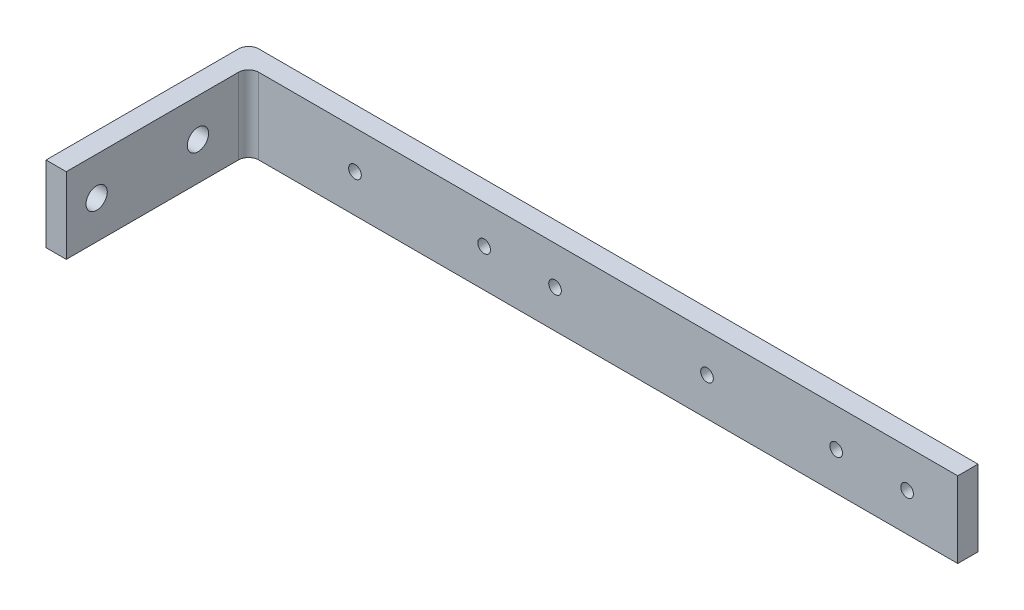
ISO-10303-21;
HEADER;
FILE_DESCRIPTION(('STEP AP214'),'2;1');
FILE_NAME('part.step','',(''),(''),'','','');
FILE_SCHEMA(('AUTOMOTIVE_DESIGN { 1 0 10303 214 1 1 1 1 }'));
ENDSEC;
DATA;
#1=APPLICATION_CONTEXT('core data for automotive mechanical design processes');
#2=APPLICATION_PROTOCOL_DEFINITION('international standard','automotive_design',2000,#1);
#3=PRODUCT_CONTEXT('',#1,'mechanical');
#4=PRODUCT('Part','Part','',(#3));
#5=PRODUCT_RELATED_PRODUCT_CATEGORY('part','',(#4));
#6=PRODUCT_DEFINITION_FORMATION('','',#4);
#7=PRODUCT_DEFINITION_CONTEXT('part definition',#1,'design');
#8=PRODUCT_DEFINITION('design','',#6,#7);
#9=PRODUCT_DEFINITION_SHAPE('','',#8);
#10=(LENGTH_UNIT() NAMED_UNIT(*) SI_UNIT(.MILLI.,.METRE.));
#11=(NAMED_UNIT(*) PLANE_ANGLE_UNIT() SI_UNIT($,.RADIAN.));
#12=(NAMED_UNIT(*) SI_UNIT($,.STERADIAN.) SOLID_ANGLE_UNIT());
#13=UNCERTAINTY_MEASURE_WITH_UNIT(LENGTH_MEASURE(1.E-05),#10,'distance_accuracy_value','');
#14=(GEOMETRIC_REPRESENTATION_CONTEXT(3) GLOBAL_UNCERTAINTY_ASSIGNED_CONTEXT((#13)) GLOBAL_UNIT_ASSIGNED_CONTEXT((#10,
#11,#12)) REPRESENTATION_CONTEXT('',''));
#15=CARTESIAN_POINT('',(0.,0.,0.));
#16=DIRECTION('',(0.,0.,1.));
#17=DIRECTION('',(1.,0.,0.));
#18=AXIS2_PLACEMENT_3D('',#15,#16,#17);
#19=CARTESIAN_POINT('',(0.,0.,4.));
#20=DIRECTION('',(0.,1.,0.));
#21=DIRECTION('',(0.,0.,1.));
#22=AXIS2_PLACEMENT_3D('',#19,#20,#21);
#23=PLANE('',#22);
#24=DIRECTION('',(0.,0.,1.));
#25=VECTOR('',#24,1.);
#26=CARTESIAN_POINT('',(-4.,0.,0.));
#27=LINE('',#26,#25);
#28=CARTESIAN_POINT('',(-4.,0.,2.));
#29=VERTEX_POINT('',#28);
#30=CARTESIAN_POINT('',(-4.,0.,40.));
#31=VERTEX_POINT('',#30);
#32=EDGE_CURVE('E109',#29,#31,#27,.T.);
#33=ORIENTED_EDGE('',*,*,#32,.F.);
#34=CARTESIAN_POINT('',(-2.,0.,2.));
#35=DIRECTION('',(0.,1.,0.));
#36=DIRECTION('',(0.,0.,1.));
#37=AXIS2_PLACEMENT_3D('',#34,#35,#36);
#38=CIRCLE('',#37,2.);
#39=CARTESIAN_POINT('',(-2.,0.,0.));
#40=VERTEX_POINT('',#39);
#41=EDGE_CURVE('E228',#29,#40,#38,.F.);
#42=ORIENTED_EDGE('',*,*,#41,.T.);
#43=DIRECTION('',(1.,0.,0.));
#44=VECTOR('',#43,1.);
#45=CARTESIAN_POINT('',(0.,0.,0.));
#46=LINE('',#45,#44);
#47=CARTESIAN_POINT('',(140.,0.,0.));
#48=VERTEX_POINT('',#47);
#49=EDGE_CURVE('E199',#40,#48,#46,.T.);
#50=ORIENTED_EDGE('',*,*,#49,.T.);
#51=DIRECTION('',(0.,0.,-1.));
#52=VECTOR('',#51,1.);
#53=CARTESIAN_POINT('',(140.,0.,4.));
#54=LINE('',#53,#52);
#55=CARTESIAN_POINT('',(140.,0.,4.));
#56=VERTEX_POINT('',#55);
#57=EDGE_CURVE('E222',#56,#48,#54,.T.);
#58=ORIENTED_EDGE('',*,*,#57,.F.);
#59=DIRECTION('',(1.,0.,0.));
#60=VECTOR('',#59,1.);
#61=CARTESIAN_POINT('',(0.,0.,4.));
#62=LINE('',#61,#60);
#63=CARTESIAN_POINT('',(2.,0.,4.));
#64=VERTEX_POINT('',#63);
#65=EDGE_CURVE('E200',#64,#56,#62,.T.);
#66=ORIENTED_EDGE('',*,*,#65,.F.);
#67=CARTESIAN_POINT('',(2.,0.,6.));
#68=DIRECTION('',(0.,1.,0.));
#69=DIRECTION('',(0.,0.,1.));
#70=AXIS2_PLACEMENT_3D('',#67,#68,#69);
#71=CIRCLE('',#70,2.);
#72=CARTESIAN_POINT('',(0.,0.,6.));
#73=VERTEX_POINT('',#72);
#74=EDGE_CURVE('E51',#64,#73,#71,.T.);
#75=ORIENTED_EDGE('',*,*,#74,.T.);
#76=DIRECTION('',(0.,0.,1.));
#77=VECTOR('',#76,1.);
#78=CARTESIAN_POINT('',(0.,0.,0.));
#79=LINE('',#78,#77);
#80=CARTESIAN_POINT('',(0.,0.,40.));
#81=VERTEX_POINT('',#80);
#82=EDGE_CURVE('E124',#73,#81,#79,.T.);
#83=ORIENTED_EDGE('',*,*,#82,.T.);
#84=DIRECTION('',(1.,0.,0.));
#85=VECTOR('',#84,1.);
#86=CARTESIAN_POINT('',(-4.,0.,40.));
#87=LINE('',#86,#85);
#88=EDGE_CURVE('E123',#31,#81,#87,.T.);
#89=ORIENTED_EDGE('',*,*,#88,.F.);
#90=EDGE_LOOP('',(#33,#42,#50,#58,#66,#75,#83,#89));
#91=FACE_BOUND('',#90,.T.);
#92=ADVANCED_FACE('F42',(#91),#23,.F.);
#93=CARTESIAN_POINT('',(140.,0.,4.));
#94=DIRECTION('',(-1.,0.,0.));
#95=DIRECTION('',(0.,0.,1.));
#96=AXIS2_PLACEMENT_3D('',#93,#94,#95);
#97=PLANE('',#96);
#98=DIRECTION('',(0.,1.,0.));
#99=VECTOR('',#98,1.);
#100=CARTESIAN_POINT('',(140.,0.,0.));
#101=LINE('',#100,#99);
#102=CARTESIAN_POINT('',(140.,15.,0.));
#103=VERTEX_POINT('',#102);
#104=EDGE_CURVE('E213',#48,#103,#101,.T.);
#105=ORIENTED_EDGE('',*,*,#104,.T.);
#106=DIRECTION('',(0.,0.,-1.));
#107=VECTOR('',#106,1.);
#108=CARTESIAN_POINT('',(140.,15.,4.));
#109=LINE('',#108,#107);
#110=CARTESIAN_POINT('',(140.,15.,4.));
#111=VERTEX_POINT('',#110);
#112=EDGE_CURVE('E210',#111,#103,#109,.T.);
#113=ORIENTED_EDGE('',*,*,#112,.F.);
#114=DIRECTION('',(0.,1.,0.));
#115=VECTOR('',#114,1.);
#116=CARTESIAN_POINT('',(140.,0.,4.));
#117=LINE('',#116,#115);
#118=EDGE_CURVE('E203',#56,#111,#117,.T.);
#119=ORIENTED_EDGE('',*,*,#118,.F.);
#120=ORIENTED_EDGE('',*,*,#57,.T.);
#121=EDGE_LOOP('',(#105,#113,#119,#120));
#122=FACE_BOUND('',#121,.T.);
#123=ADVANCED_FACE('F264',(#122),#97,.F.);
#124=CARTESIAN_POINT('',(0.,15.,4.));
#125=DIRECTION('',(0.,-1.,0.));
#126=DIRECTION('',(0.,0.,-1.));
#127=AXIS2_PLACEMENT_3D('',#124,#125,#126);
#128=PLANE('',#127);
#129=DIRECTION('',(-1.,0.,0.));
#130=VECTOR('',#129,1.);
#131=CARTESIAN_POINT('',(0.,15.,0.));
#132=LINE('',#131,#130);
#133=CARTESIAN_POINT('',(-2.,15.,0.));
#134=VERTEX_POINT('',#133);
#135=EDGE_CURVE('E204',#103,#134,#132,.T.);
#136=ORIENTED_EDGE('',*,*,#135,.T.);
#137=CARTESIAN_POINT('',(-2.,15.,2.));
#138=DIRECTION('',(0.,-1.,0.));
#139=DIRECTION('',(0.,0.,-1.));
#140=AXIS2_PLACEMENT_3D('',#137,#138,#139);
#141=CIRCLE('',#140,2.);
#142=CARTESIAN_POINT('',(-4.,15.,2.));
#143=VERTEX_POINT('',#142);
#144=EDGE_CURVE('E234',#134,#143,#141,.F.);
#145=ORIENTED_EDGE('',*,*,#144,.T.);
#146=DIRECTION('',(0.,0.,-1.));
#147=VECTOR('',#146,1.);
#148=CARTESIAN_POINT('',(-4.,15.,0.));
#149=LINE('',#148,#147);
#150=CARTESIAN_POINT('',(-4.,15.,40.));
#151=VERTEX_POINT('',#150);
#152=EDGE_CURVE('E135',#151,#143,#149,.T.);
#153=ORIENTED_EDGE('',*,*,#152,.F.);
#154=DIRECTION('',(1.,0.,0.));
#155=VECTOR('',#154,1.);
#156=CARTESIAN_POINT('',(-4.,15.,40.));
#157=LINE('',#156,#155);
#158=CARTESIAN_POINT('',(0.,15.,40.));
#159=VERTEX_POINT('',#158);
#160=EDGE_CURVE('E129',#151,#159,#157,.T.);
#161=ORIENTED_EDGE('',*,*,#160,.T.);
#162=DIRECTION('',(0.,0.,-1.));
#163=VECTOR('',#162,1.);
#164=CARTESIAN_POINT('',(0.,15.,0.));
#165=LINE('',#164,#163);
#166=CARTESIAN_POINT('',(0.,15.,6.));
#167=VERTEX_POINT('',#166);
#168=EDGE_CURVE('E120',#159,#167,#165,.T.);
#169=ORIENTED_EDGE('',*,*,#168,.T.);
#170=CARTESIAN_POINT('',(2.,15.,6.));
#171=DIRECTION('',(0.,-1.,0.));
#172=DIRECTION('',(0.,0.,-1.));
#173=AXIS2_PLACEMENT_3D('',#170,#171,#172);
#174=CIRCLE('',#173,2.);
#175=CARTESIAN_POINT('',(2.,15.,4.));
#176=VERTEX_POINT('',#175);
#177=EDGE_CURVE('E11',#167,#176,#174,.T.);
#178=ORIENTED_EDGE('',*,*,#177,.T.);
#179=DIRECTION('',(-1.,0.,0.));
#180=VECTOR('',#179,1.);
#181=CARTESIAN_POINT('',(0.,15.,4.));
#182=LINE('',#181,#180);
#183=EDGE_CURVE('E207',#111,#176,#182,.T.);
#184=ORIENTED_EDGE('',*,*,#183,.F.);
#185=ORIENTED_EDGE('',*,*,#112,.T.);
#186=EDGE_LOOP('',(#136,#145,#153,#161,#169,#178,#184,#185));
#187=FACE_BOUND('',#186,.T.);
#188=ADVANCED_FACE('F253',(#187),#128,.F.);
#189=CARTESIAN_POINT('',(0.,0.,4.));
#190=DIRECTION('',(0.,0.,-1.));
#191=DIRECTION('',(-1.,0.,0.));
#192=AXIS2_PLACEMENT_3D('',#189,#190,#191);
#193=PLANE('',#192);
#194=CARTESIAN_POINT('',(130.,7.5,4.));
#195=DIRECTION('',(0.,0.,-1.));
#196=DIRECTION('',(-1.,0.,0.));
#197=AXIS2_PLACEMENT_3D('',#194,#195,#196);
#198=CIRCLE('',#197,1.25);
#199=CARTESIAN_POINT('',(128.75,7.5,4.));
#200=VERTEX_POINT('',#199);
#201=EDGE_CURVE('E155',#200,#200,#198,.T.);
#202=ORIENTED_EDGE('',*,*,#201,.T.);
#203=EDGE_LOOP('',(#202));
#204=FACE_BOUND('',#203,.T.);
#205=CARTESIAN_POINT('',(116.,7.5,4.));
#206=DIRECTION('',(0.,0.,-1.));
#207=DIRECTION('',(-1.,0.,0.));
#208=AXIS2_PLACEMENT_3D('',#205,#206,#207);
#209=CIRCLE('',#208,1.25);
#210=CARTESIAN_POINT('',(114.75,7.5,4.));
#211=VERTEX_POINT('',#210);
#212=EDGE_CURVE('E163',#211,#211,#209,.T.);
#213=ORIENTED_EDGE('',*,*,#212,.T.);
#214=EDGE_LOOP('',(#213));
#215=FACE_BOUND('',#214,.T.);
#216=CARTESIAN_POINT('',(90.5,7.5,4.));
#217=DIRECTION('',(0.,0.,-1.));
#218=DIRECTION('',(-1.,0.,0.));
#219=AXIS2_PLACEMENT_3D('',#216,#217,#218);
#220=CIRCLE('',#219,1.25);
#221=CARTESIAN_POINT('',(89.25,7.5,4.));
#222=VERTEX_POINT('',#221);
#223=EDGE_CURVE('E171',#222,#222,#220,.T.);
#224=ORIENTED_EDGE('',*,*,#223,.T.);
#225=EDGE_LOOP('',(#224));
#226=FACE_BOUND('',#225,.T.);
#227=CARTESIAN_POINT('',(60.5,7.5,4.));
#228=DIRECTION('',(0.,0.,-1.));
#229=DIRECTION('',(-1.,0.,0.));
#230=AXIS2_PLACEMENT_3D('',#227,#228,#229);
#231=CIRCLE('',#230,1.25);
#232=CARTESIAN_POINT('',(59.25,7.5,4.));
#233=VERTEX_POINT('',#232);
#234=EDGE_CURVE('E179',#233,#233,#231,.T.);
#235=ORIENTED_EDGE('',*,*,#234,.T.);
#236=EDGE_LOOP('',(#235));
#237=FACE_BOUND('',#236,.T.);
#238=CARTESIAN_POINT('',(46.5,7.5,4.));
#239=DIRECTION('',(0.,0.,-1.));
#240=DIRECTION('',(-1.,0.,0.));
#241=AXIS2_PLACEMENT_3D('',#238,#239,#240);
#242=CIRCLE('',#241,1.25);
#243=CARTESIAN_POINT('',(45.25,7.5,4.));
#244=VERTEX_POINT('',#243);
#245=EDGE_CURVE('E187',#244,#244,#242,.T.);
#246=ORIENTED_EDGE('',*,*,#245,.T.);
#247=EDGE_LOOP('',(#246));
#248=FACE_BOUND('',#247,.T.);
#249=CARTESIAN_POINT('',(21.,7.5,4.));
#250=DIRECTION('',(0.,0.,-1.));
#251=DIRECTION('',(-1.,0.,0.));
#252=AXIS2_PLACEMENT_3D('',#249,#250,#251);
#253=CIRCLE('',#252,1.25);
#254=CARTESIAN_POINT('',(19.75,7.5,4.));
#255=VERTEX_POINT('',#254);
#256=EDGE_CURVE('E195',#255,#255,#253,.T.);
#257=ORIENTED_EDGE('',*,*,#256,.T.);
#258=EDGE_LOOP('',(#257));
#259=FACE_BOUND('',#258,.T.);
#260=ORIENTED_EDGE('',*,*,#183,.T.);
#261=DIRECTION('',(0.,-1.,0.));
#262=VECTOR('',#261,1.);
#263=CARTESIAN_POINT('',(2.,0.,4.));
#264=LINE('',#263,#262);
#265=EDGE_CURVE('E237',#176,#64,#264,.T.);
#266=ORIENTED_EDGE('',*,*,#265,.T.);
#267=ORIENTED_EDGE('',*,*,#65,.T.);
#268=ORIENTED_EDGE('',*,*,#118,.T.);
#269=EDGE_LOOP('',(#260,#266,#267,#268));
#270=FACE_BOUND('',#269,.T.);
#271=ADVANCED_FACE('F250',(#204,#215,#226,#237,#248,#259,#270),#193,.F.);
#272=CARTESIAN_POINT('',(0.,0.,0.));
#273=DIRECTION('',(0.,0.,-1.));
#274=DIRECTION('',(-1.,0.,0.));
#275=AXIS2_PLACEMENT_3D('',#272,#273,#274);
#276=PLANE('',#275);
#277=CARTESIAN_POINT('',(130.,7.5,0.));
#278=DIRECTION('',(0.,0.,-1.));
#279=DIRECTION('',(-1.,0.,0.));
#280=AXIS2_PLACEMENT_3D('',#277,#278,#279);
#281=CIRCLE('',#280,1.24999999999997);
#282=CARTESIAN_POINT('',(128.75,7.5,0.));
#283=VERTEX_POINT('',#282);
#284=EDGE_CURVE('E128',#283,#283,#281,.T.);
#285=ORIENTED_EDGE('',*,*,#284,.F.);
#286=EDGE_LOOP('',(#285));
#287=FACE_BOUND('',#286,.T.);
#288=CARTESIAN_POINT('',(116.,7.5,0.));
#289=DIRECTION('',(0.,0.,-1.));
#290=DIRECTION('',(-1.,0.,0.));
#291=AXIS2_PLACEMENT_3D('',#288,#289,#290);
#292=CIRCLE('',#291,1.24999999999999);
#293=CARTESIAN_POINT('',(114.75,7.5,0.));
#294=VERTEX_POINT('',#293);
#295=EDGE_CURVE('E159',#294,#294,#292,.T.);
#296=ORIENTED_EDGE('',*,*,#295,.F.);
#297=EDGE_LOOP('',(#296));
#298=FACE_BOUND('',#297,.T.);
#299=CARTESIAN_POINT('',(90.5,7.5,0.));
#300=DIRECTION('',(0.,0.,-1.));
#301=DIRECTION('',(-1.,0.,0.));
#302=AXIS2_PLACEMENT_3D('',#299,#300,#301);
#303=CIRCLE('',#302,1.24999999999999);
#304=CARTESIAN_POINT('',(89.25,7.5,0.));
#305=VERTEX_POINT('',#304);
#306=EDGE_CURVE('E167',#305,#305,#303,.T.);
#307=ORIENTED_EDGE('',*,*,#306,.F.);
#308=EDGE_LOOP('',(#307));
#309=FACE_BOUND('',#308,.T.);
#310=CARTESIAN_POINT('',(60.5,7.5,0.));
#311=DIRECTION('',(0.,0.,-1.));
#312=DIRECTION('',(-1.,0.,0.));
#313=AXIS2_PLACEMENT_3D('',#310,#311,#312);
#314=CIRCLE('',#313,1.24999999999999);
#315=CARTESIAN_POINT('',(59.25,7.5,0.));
#316=VERTEX_POINT('',#315);
#317=EDGE_CURVE('E175',#316,#316,#314,.T.);
#318=ORIENTED_EDGE('',*,*,#317,.F.);
#319=EDGE_LOOP('',(#318));
#320=FACE_BOUND('',#319,.T.);
#321=CARTESIAN_POINT('',(46.5,7.5,0.));
#322=DIRECTION('',(0.,0.,-1.));
#323=DIRECTION('',(-1.,0.,0.));
#324=AXIS2_PLACEMENT_3D('',#321,#322,#323);
#325=CIRCLE('',#324,1.24999999999999);
#326=CARTESIAN_POINT('',(45.25,7.5,0.));
#327=VERTEX_POINT('',#326);
#328=EDGE_CURVE('E183',#327,#327,#325,.T.);
#329=ORIENTED_EDGE('',*,*,#328,.F.);
#330=EDGE_LOOP('',(#329));
#331=FACE_BOUND('',#330,.T.);
#332=CARTESIAN_POINT('',(21.,7.5,0.));
#333=DIRECTION('',(0.,0.,-1.));
#334=DIRECTION('',(-1.,0.,0.));
#335=AXIS2_PLACEMENT_3D('',#332,#333,#334);
#336=CIRCLE('',#335,1.24999999999999);
#337=CARTESIAN_POINT('',(19.75,7.5,0.));
#338=VERTEX_POINT('',#337);
#339=EDGE_CURVE('E191',#338,#338,#336,.T.);
#340=ORIENTED_EDGE('',*,*,#339,.F.);
#341=EDGE_LOOP('',(#340));
#342=FACE_BOUND('',#341,.T.);
#343=ORIENTED_EDGE('',*,*,#49,.F.);
#344=DIRECTION('',(0.,-1.,0.));
#345=VECTOR('',#344,1.);
#346=CARTESIAN_POINT('',(-2.,15.,0.));
#347=LINE('',#346,#345);
#348=EDGE_CURVE('E231',#40,#134,#347,.F.);
#349=ORIENTED_EDGE('',*,*,#348,.T.);
#350=ORIENTED_EDGE('',*,*,#135,.F.);
#351=ORIENTED_EDGE('',*,*,#104,.F.);
#352=EDGE_LOOP('',(#343,#349,#350,#351));
#353=FACE_BOUND('',#352,.T.);
#354=ADVANCED_FACE('F260',(#287,#298,#309,#320,#331,#342,#353),#276,.T.);
#355=CARTESIAN_POINT('',(21.,7.5,0.));
#356=DIRECTION('',(0.,0.,-1.));
#357=DIRECTION('',(-1.,0.,0.));
#358=AXIS2_PLACEMENT_3D('',#355,#356,#357);
#359=CYLINDRICAL_SURFACE('',#358,1.24999999999999);
#360=ORIENTED_EDGE('',*,*,#256,.F.);
#361=EDGE_LOOP('',(#360));
#362=FACE_BOUND('',#361,.T.);
#363=ORIENTED_EDGE('',*,*,#339,.T.);
#364=EDGE_LOOP('',(#363));
#365=FACE_BOUND('',#364,.T.);
#366=ADVANCED_FACE('F313',(#362,#365),#359,.F.);
#367=CARTESIAN_POINT('',(46.5,7.5,0.));
#368=DIRECTION('',(0.,0.,-1.));
#369=DIRECTION('',(-1.,0.,0.));
#370=AXIS2_PLACEMENT_3D('',#367,#368,#369);
#371=CYLINDRICAL_SURFACE('',#370,1.24999999999999);
#372=ORIENTED_EDGE('',*,*,#245,.F.);
#373=EDGE_LOOP('',(#372));
#374=FACE_BOUND('',#373,.T.);
#375=ORIENTED_EDGE('',*,*,#328,.T.);
#376=EDGE_LOOP('',(#375));
#377=FACE_BOUND('',#376,.T.);
#378=ADVANCED_FACE('F309',(#374,#377),#371,.F.);
#379=CARTESIAN_POINT('',(60.5,7.5,0.));
#380=DIRECTION('',(0.,0.,-1.));
#381=DIRECTION('',(-1.,0.,0.));
#382=AXIS2_PLACEMENT_3D('',#379,#380,#381);
#383=CYLINDRICAL_SURFACE('',#382,1.24999999999999);
#384=ORIENTED_EDGE('',*,*,#234,.F.);
#385=EDGE_LOOP('',(#384));
#386=FACE_BOUND('',#385,.T.);
#387=ORIENTED_EDGE('',*,*,#317,.T.);
#388=EDGE_LOOP('',(#387));
#389=FACE_BOUND('',#388,.T.);
#390=ADVANCED_FACE('F305',(#386,#389),#383,.F.);
#391=CARTESIAN_POINT('',(90.5,7.5,0.));
#392=DIRECTION('',(0.,0.,-1.));
#393=DIRECTION('',(-1.,0.,0.));
#394=AXIS2_PLACEMENT_3D('',#391,#392,#393);
#395=CYLINDRICAL_SURFACE('',#394,1.24999999999999);
#396=ORIENTED_EDGE('',*,*,#223,.F.);
#397=EDGE_LOOP('',(#396));
#398=FACE_BOUND('',#397,.T.);
#399=ORIENTED_EDGE('',*,*,#306,.T.);
#400=EDGE_LOOP('',(#399));
#401=FACE_BOUND('',#400,.T.);
#402=ADVANCED_FACE('F301',(#398,#401),#395,.F.);
#403=CARTESIAN_POINT('',(116.,7.5,0.));
#404=DIRECTION('',(0.,0.,-1.));
#405=DIRECTION('',(-1.,0.,0.));
#406=AXIS2_PLACEMENT_3D('',#403,#404,#405);
#407=CYLINDRICAL_SURFACE('',#406,1.24999999999999);
#408=ORIENTED_EDGE('',*,*,#212,.F.);
#409=EDGE_LOOP('',(#408));
#410=FACE_BOUND('',#409,.T.);
#411=ORIENTED_EDGE('',*,*,#295,.T.);
#412=EDGE_LOOP('',(#411));
#413=FACE_BOUND('',#412,.T.);
#414=ADVANCED_FACE('F297',(#410,#413),#407,.F.);
#415=CARTESIAN_POINT('',(130.,7.5,0.));
#416=DIRECTION('',(0.,0.,-1.));
#417=DIRECTION('',(-1.,0.,0.));
#418=AXIS2_PLACEMENT_3D('',#415,#416,#417);
#419=CYLINDRICAL_SURFACE('',#418,1.24999999999999);
#420=ORIENTED_EDGE('',*,*,#201,.F.);
#421=EDGE_LOOP('',(#420));
#422=FACE_BOUND('',#421,.T.);
#423=ORIENTED_EDGE('',*,*,#284,.T.);
#424=EDGE_LOOP('',(#423));
#425=FACE_BOUND('',#424,.T.);
#426=ADVANCED_FACE('F292',(#422,#425),#419,.F.);
#427=CARTESIAN_POINT('',(0.,0.,0.));
#428=DIRECTION('',(1.,0.,0.));
#429=DIRECTION('',(0.,0.,-1.));
#430=AXIS2_PLACEMENT_3D('',#427,#428,#429);
#431=PLANE('',#430);
#432=CARTESIAN_POINT('',(0.,7.5,34.));
#433=DIRECTION('',(1.,0.,0.));
#434=DIRECTION('',(0.,0.,-1.));
#435=AXIS2_PLACEMENT_3D('',#432,#433,#434);
#436=CIRCLE('',#435,2.09999999999999);
#437=CARTESIAN_POINT('',(0.,7.5,31.9));
#438=VERTEX_POINT('',#437);
#439=EDGE_CURVE('E509',#438,#438,#436,.T.);
#440=ORIENTED_EDGE('',*,*,#439,.F.);
#441=EDGE_LOOP('',(#440));
#442=FACE_BOUND('',#441,.T.);
#443=CARTESIAN_POINT('',(0.,7.5,14.));
#444=DIRECTION('',(1.,0.,0.));
#445=DIRECTION('',(0.,0.,-1.));
#446=AXIS2_PLACEMENT_3D('',#443,#444,#445);
#447=CIRCLE('',#446,2.09999999999999);
#448=CARTESIAN_POINT('',(0.,7.5,11.9));
#449=VERTEX_POINT('',#448);
#450=EDGE_CURVE('E145',#449,#449,#447,.T.);
#451=ORIENTED_EDGE('',*,*,#450,.F.);
#452=EDGE_LOOP('',(#451));
#453=FACE_BOUND('',#452,.T.);
#454=ORIENTED_EDGE('',*,*,#82,.F.);
#455=DIRECTION('',(0.,-1.,0.));
#456=VECTOR('',#455,1.);
#457=CARTESIAN_POINT('',(0.,0.,6.));
#458=LINE('',#457,#456);
#459=EDGE_CURVE('E64',#73,#167,#458,.F.);
#460=ORIENTED_EDGE('',*,*,#459,.T.);
#461=ORIENTED_EDGE('',*,*,#168,.F.);
#462=DIRECTION('',(0.,1.,0.));
#463=VECTOR('',#462,1.);
#464=CARTESIAN_POINT('',(0.,0.,40.));
#465=LINE('',#464,#463);
#466=EDGE_CURVE('E144',#81,#159,#465,.T.);
#467=ORIENTED_EDGE('',*,*,#466,.F.);
#468=EDGE_LOOP('',(#454,#460,#461,#467));
#469=FACE_BOUND('',#468,.T.);
#470=ADVANCED_FACE('F248',(#442,#453,#469),#431,.T.);
#471=CARTESIAN_POINT('',(-4.,0.,40.));
#472=DIRECTION('',(0.,0.,-1.));
#473=DIRECTION('',(-1.,0.,0.));
#474=AXIS2_PLACEMENT_3D('',#471,#472,#473);
#475=PLANE('',#474);
#476=ORIENTED_EDGE('',*,*,#466,.T.);
#477=ORIENTED_EDGE('',*,*,#160,.F.);
#478=DIRECTION('',(0.,1.,0.));
#479=VECTOR('',#478,1.);
#480=CARTESIAN_POINT('',(-4.,0.,40.));
#481=LINE('',#480,#479);
#482=EDGE_CURVE('E114',#31,#151,#481,.T.);
#483=ORIENTED_EDGE('',*,*,#482,.F.);
#484=ORIENTED_EDGE('',*,*,#88,.T.);
#485=EDGE_LOOP('',(#476,#477,#483,#484));
#486=FACE_BOUND('',#485,.T.);
#487=ADVANCED_FACE('F131',(#486),#475,.F.);
#488=CARTESIAN_POINT('',(-4.,0.,0.));
#489=DIRECTION('',(1.,0.,0.));
#490=DIRECTION('',(0.,0.,-1.));
#491=AXIS2_PLACEMENT_3D('',#488,#489,#490);
#492=PLANE('',#491);
#493=CARTESIAN_POINT('',(-4.,7.5,34.));
#494=DIRECTION('',(-1.,0.,0.));
#495=DIRECTION('',(0.,0.,1.));
#496=AXIS2_PLACEMENT_3D('',#493,#494,#495);
#497=CIRCLE('',#496,2.1);
#498=CARTESIAN_POINT('',(-4.,7.5,36.1));
#499=VERTEX_POINT('',#498);
#500=EDGE_CURVE('E511',#499,#499,#497,.T.);
#501=ORIENTED_EDGE('',*,*,#500,.F.);
#502=EDGE_LOOP('',(#501));
#503=FACE_BOUND('',#502,.T.);
#504=CARTESIAN_POINT('',(-4.,7.5,14.));
#505=DIRECTION('',(-1.,0.,0.));
#506=DIRECTION('',(0.,0.,1.));
#507=AXIS2_PLACEMENT_3D('',#504,#505,#506);
#508=CIRCLE('',#507,2.1);
#509=CARTESIAN_POINT('',(-4.,7.5,16.1));
#510=VERTEX_POINT('',#509);
#511=EDGE_CURVE('E516',#510,#510,#508,.T.);
#512=ORIENTED_EDGE('',*,*,#511,.F.);
#513=EDGE_LOOP('',(#512));
#514=FACE_BOUND('',#513,.T.);
#515=ORIENTED_EDGE('',*,*,#152,.T.);
#516=DIRECTION('',(0.,-1.,0.));
#517=VECTOR('',#516,1.);
#518=CARTESIAN_POINT('',(-4.,0.,2.));
#519=LINE('',#518,#517);
#520=EDGE_CURVE('E117',#143,#29,#519,.T.);
#521=ORIENTED_EDGE('',*,*,#520,.T.);
#522=ORIENTED_EDGE('',*,*,#32,.T.);
#523=ORIENTED_EDGE('',*,*,#482,.T.);
#524=EDGE_LOOP('',(#515,#521,#522,#523));
#525=FACE_BOUND('',#524,.T.);
#526=ADVANCED_FACE('F112',(#503,#514,#525),#492,.F.);
#527=CARTESIAN_POINT('',(-2.,0.,2.));
#528=DIRECTION('',(0.,1.,0.));
#529=DIRECTION('',(0.,0.,1.));
#530=AXIS2_PLACEMENT_3D('',#527,#528,#529);
#531=CYLINDRICAL_SURFACE('',#530,2.);
#532=ORIENTED_EDGE('',*,*,#144,.F.);
#533=ORIENTED_EDGE('',*,*,#348,.F.);
#534=ORIENTED_EDGE('',*,*,#41,.F.);
#535=ORIENTED_EDGE('',*,*,#520,.F.);
#536=EDGE_LOOP('',(#532,#533,#534,#535));
#537=FACE_BOUND('',#536,.T.);
#538=ADVANCED_FACE('F263',(#537),#531,.T.);
#539=CARTESIAN_POINT('',(2.,0.,6.));
#540=DIRECTION('',(0.,-1.,0.));
#541=DIRECTION('',(0.,0.,-1.));
#542=AXIS2_PLACEMENT_3D('',#539,#540,#541);
#543=CYLINDRICAL_SURFACE('',#542,2.);
#544=ORIENTED_EDGE('',*,*,#177,.F.);
#545=ORIENTED_EDGE('',*,*,#459,.F.);
#546=ORIENTED_EDGE('',*,*,#74,.F.);
#547=ORIENTED_EDGE('',*,*,#265,.F.);
#548=EDGE_LOOP('',(#544,#545,#546,#547));
#549=FACE_BOUND('',#548,.T.);
#550=ADVANCED_FACE('F44',(#549),#543,.F.);
#551=CARTESIAN_POINT('',(-4.,7.5,14.));
#552=DIRECTION('',(-1.,0.,0.));
#553=DIRECTION('',(0.,0.,1.));
#554=AXIS2_PLACEMENT_3D('',#551,#552,#553);
#555=CYLINDRICAL_SURFACE('',#554,2.09999999999999);
#556=ORIENTED_EDGE('',*,*,#450,.T.);
#557=EDGE_LOOP('',(#556));
#558=FACE_BOUND('',#557,.T.);
#559=ORIENTED_EDGE('',*,*,#511,.T.);
#560=EDGE_LOOP('',(#559));
#561=FACE_BOUND('',#560,.T.);
#562=ADVANCED_FACE('F279',(#558,#561),#555,.F.);
#563=CARTESIAN_POINT('',(-4.,7.5,34.));
#564=DIRECTION('',(-1.,0.,0.));
#565=DIRECTION('',(0.,0.,1.));
#566=AXIS2_PLACEMENT_3D('',#563,#564,#565);
#567=CYLINDRICAL_SURFACE('',#566,2.09999999999999);
#568=ORIENTED_EDGE('',*,*,#439,.T.);
#569=EDGE_LOOP('',(#568));
#570=FACE_BOUND('',#569,.T.);
#571=ORIENTED_EDGE('',*,*,#500,.T.);
#572=EDGE_LOOP('',(#571));
#573=FACE_BOUND('',#572,.T.);
#574=ADVANCED_FACE('F486',(#570,#573),#567,.F.);
#575=CLOSED_SHELL('',(#92,#123,#188,#271,#354,#366,#378,#390,#402,#414,#426,#470,#487,#526,#538,
#550,#562,#574));
#576=MANIFOLD_SOLID_BREP('B2',#575);
#577=ADVANCED_BREP_SHAPE_REPRESENTATION('',(#18,#576),#14);
#578=SHAPE_DEFINITION_REPRESENTATION(#9,#577);
ENDSEC;
END-ISO-10303-21;
